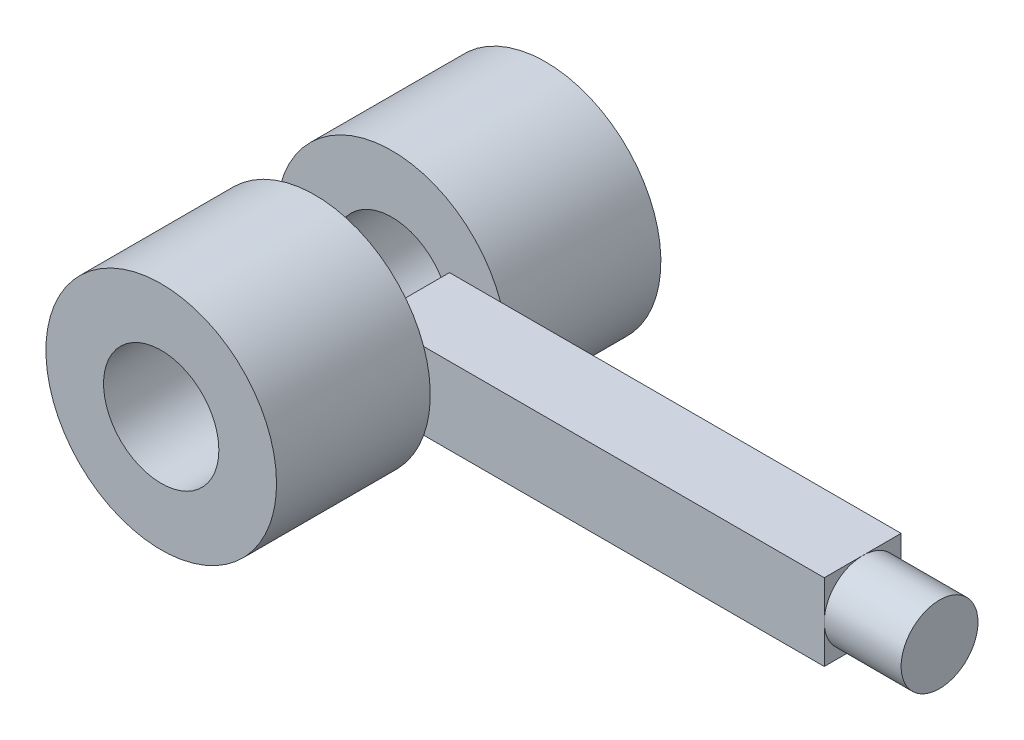
ISO-10303-21;
HEADER;
FILE_DESCRIPTION(('STEP AP214'),'2;1');
FILE_NAME('part.step','',(''),(''),'','','');
FILE_SCHEMA(('AUTOMOTIVE_DESIGN { 1 0 10303 214 1 1 1 1 }'));
ENDSEC;
DATA;
#1=APPLICATION_CONTEXT('core data for automotive mechanical design processes');
#2=APPLICATION_PROTOCOL_DEFINITION('international standard','automotive_design',2000,#1);
#3=PRODUCT_CONTEXT('',#1,'mechanical');
#4=PRODUCT('Part','Part','',(#3));
#5=PRODUCT_RELATED_PRODUCT_CATEGORY('part','',(#4));
#6=PRODUCT_DEFINITION_FORMATION('','',#4);
#7=PRODUCT_DEFINITION_CONTEXT('part definition',#1,'design');
#8=PRODUCT_DEFINITION('design','',#6,#7);
#9=PRODUCT_DEFINITION_SHAPE('','',#8);
#10=(LENGTH_UNIT() NAMED_UNIT(*) SI_UNIT(.MILLI.,.METRE.));
#11=(NAMED_UNIT(*) PLANE_ANGLE_UNIT() SI_UNIT($,.RADIAN.));
#12=(NAMED_UNIT(*) SI_UNIT($,.STERADIAN.) SOLID_ANGLE_UNIT());
#13=UNCERTAINTY_MEASURE_WITH_UNIT(LENGTH_MEASURE(1.E-05),#10,'distance_accuracy_value','');
#14=(GEOMETRIC_REPRESENTATION_CONTEXT(3) GLOBAL_UNCERTAINTY_ASSIGNED_CONTEXT((#13)) GLOBAL_UNIT_ASSIGNED_CONTEXT((#10,
#11,#12)) REPRESENTATION_CONTEXT('',''));
#15=CARTESIAN_POINT('',(0.,0.,0.));
#16=DIRECTION('',(0.,0.,1.));
#17=DIRECTION('',(1.,0.,0.));
#18=AXIS2_PLACEMENT_3D('',#15,#16,#17);
#19=CARTESIAN_POINT('',(13.25,0.,0.));
#20=DIRECTION('',(1.,0.,0.));
#21=DIRECTION('',(0.,0.,-1.));
#22=AXIS2_PLACEMENT_3D('',#19,#20,#21);
#23=PLANE('',#22);
#24=CARTESIAN_POINT('',(13.25,0.,-1.));
#25=DIRECTION('',(1.,0.,0.));
#26=DIRECTION('',(0.,0.,-1.));
#27=AXIS2_PLACEMENT_3D('',#24,#25,#26);
#28=CIRCLE('',#27,1.);
#29=CARTESIAN_POINT('',(13.25,0.,-2.));
#30=VERTEX_POINT('',#29);
#31=CARTESIAN_POINT('',(13.25,1.,-1.));
#32=VERTEX_POINT('',#31);
#33=EDGE_CURVE('E48',#30,#32,#28,.T.);
#34=ORIENTED_EDGE('',*,*,#33,.F.);
#35=DIRECTION('',(0.,1.,0.));
#36=VECTOR('',#35,1.);
#37=CARTESIAN_POINT('',(13.25,-1.,-2.));
#38=LINE('',#37,#36);
#39=CARTESIAN_POINT('',(13.25,1.,-2.));
#40=VERTEX_POINT('',#39);
#41=EDGE_CURVE('E117',#30,#40,#38,.T.);
#42=ORIENTED_EDGE('',*,*,#41,.T.);
#43=DIRECTION('',(0.,0.,1.));
#44=VECTOR('',#43,1.);
#45=CARTESIAN_POINT('',(13.25,1.,-2.));
#46=LINE('',#45,#44);
#47=EDGE_CURVE('E129',#40,#32,#46,.T.);
#48=ORIENTED_EDGE('',*,*,#47,.T.);
#49=EDGE_LOOP('',(#34,#42,#48));
#50=FACE_BOUND('',#49,.T.);
#51=ADVANCED_FACE('F37',(#50),#23,.T.);
#52=CARTESIAN_POINT('',(13.25,0.,0.));
#53=VERTEX_POINT('',#52);
#54=EDGE_CURVE('E11',#32,#53,#28,.T.);
#55=ORIENTED_EDGE('',*,*,#54,.F.);
#56=CARTESIAN_POINT('',(13.25,1.,0.));
#57=VERTEX_POINT('',#56);
#58=EDGE_CURVE('E142',#32,#57,#46,.T.);
#59=ORIENTED_EDGE('',*,*,#58,.T.);
#60=DIRECTION('',(0.,-1.,0.));
#61=VECTOR('',#60,1.);
#62=CARTESIAN_POINT('',(13.25,1.,0.));
#63=LINE('',#62,#61);
#64=EDGE_CURVE('E143',#57,#53,#63,.T.);
#65=ORIENTED_EDGE('',*,*,#64,.T.);
#66=EDGE_LOOP('',(#55,#59,#65));
#67=FACE_BOUND('',#66,.T.);
#68=ADVANCED_FACE('F218',(#67),#23,.T.);
#69=CARTESIAN_POINT('',(13.25,-1.,-1.));
#70=VERTEX_POINT('',#69);
#71=EDGE_CURVE('E46',#53,#70,#28,.T.);
#72=ORIENTED_EDGE('',*,*,#71,.F.);
#73=CARTESIAN_POINT('',(13.25,-1.,0.));
#74=VERTEX_POINT('',#73);
#75=EDGE_CURVE('E141',#53,#74,#63,.T.);
#76=ORIENTED_EDGE('',*,*,#75,.T.);
#77=DIRECTION('',(0.,0.,-1.));
#78=VECTOR('',#77,1.);
#79=CARTESIAN_POINT('',(13.25,-1.,0.));
#80=LINE('',#79,#78);
#81=EDGE_CURVE('E127',#74,#70,#80,.T.);
#82=ORIENTED_EDGE('',*,*,#81,.T.);
#83=EDGE_LOOP('',(#72,#76,#82));
#84=FACE_BOUND('',#83,.T.);
#85=ADVANCED_FACE('F216',(#84),#23,.T.);
#86=CARTESIAN_POINT('',(0.,0.,0.));
#87=DIRECTION('',(0.,0.,1.));
#88=DIRECTION('',(1.,0.,0.));
#89=AXIS2_PLACEMENT_3D('',#86,#87,#88);
#90=PLANE('',#89);
#91=CARTESIAN_POINT('',(0.,0.,0.));
#92=DIRECTION('',(0.,0.,1.));
#93=DIRECTION('',(1.,0.,0.));
#94=AXIS2_PLACEMENT_3D('',#91,#92,#93);
#95=CIRCLE('',#94,3.);
#96=CARTESIAN_POINT('',(2.82842712474619,1.,0.));
#97=VERTEX_POINT('',#96);
#98=CARTESIAN_POINT('',(2.82842712474619,-1.,0.));
#99=VERTEX_POINT('',#98);
#100=EDGE_CURVE('E41',#97,#99,#95,.T.);
#101=ORIENTED_EDGE('',*,*,#100,.F.);
#102=DIRECTION('',(-1.,0.,0.));
#103=VECTOR('',#102,1.);
#104=CARTESIAN_POINT('',(2.5,1.,0.));
#105=LINE('',#104,#103);
#106=CARTESIAN_POINT('',(1.5,1.,0.));
#107=VERTEX_POINT('',#106);
#108=EDGE_CURVE('E187',#97,#107,#105,.T.);
#109=ORIENTED_EDGE('',*,*,#108,.T.);
#110=DIRECTION('',(0.,-1.,0.));
#111=VECTOR('',#110,1.);
#112=CARTESIAN_POINT('',(1.5,-1.,0.));
#113=LINE('',#112,#111);
#114=CARTESIAN_POINT('',(1.5,0.,0.));
#115=VERTEX_POINT('',#114);
#116=EDGE_CURVE('E137',#107,#115,#113,.T.);
#117=ORIENTED_EDGE('',*,*,#116,.T.);
#118=CARTESIAN_POINT('',(0.,0.,0.));
#119=DIRECTION('',(0.,0.,1.));
#120=DIRECTION('',(1.,0.,0.));
#121=AXIS2_PLACEMENT_3D('',#118,#119,#120);
#122=CIRCLE('',#121,1.5);
#123=EDGE_CURVE('E190',#115,#115,#122,.T.);
#124=ORIENTED_EDGE('',*,*,#123,.T.);
#125=CARTESIAN_POINT('',(1.5,-1.,0.));
#126=VERTEX_POINT('',#125);
#127=EDGE_CURVE('E133',#115,#126,#113,.T.);
#128=ORIENTED_EDGE('',*,*,#127,.T.);
#129=DIRECTION('',(1.,0.,0.));
#130=VECTOR('',#129,1.);
#131=CARTESIAN_POINT('',(2.5,-1.,0.));
#132=LINE('',#131,#130);
#133=EDGE_CURVE('E191',#126,#99,#132,.T.);
#134=ORIENTED_EDGE('',*,*,#133,.T.);
#135=EDGE_LOOP('',(#101,#109,#117,#124,#128,#134));
#136=FACE_BOUND('',#135,.T.);
#137=ADVANCED_FACE('F206',(#136),#90,.F.);
#138=CARTESIAN_POINT('',(0.,0.,-2.));
#139=DIRECTION('',(0.,0.,-1.));
#140=DIRECTION('',(-1.,0.,0.));
#141=AXIS2_PLACEMENT_3D('',#138,#139,#140);
#142=PLANE('',#141);
#143=DIRECTION('',(-1.,0.,0.));
#144=VECTOR('',#143,1.);
#145=CARTESIAN_POINT('',(2.5,1.,-2.));
#146=LINE('',#145,#144);
#147=CARTESIAN_POINT('',(2.82842712474619,1.,-2.));
#148=VERTEX_POINT('',#147);
#149=CARTESIAN_POINT('',(1.5,1.,-2.));
#150=VERTEX_POINT('',#149);
#151=EDGE_CURVE('E173',#148,#150,#146,.T.);
#152=ORIENTED_EDGE('',*,*,#151,.F.);
#153=CARTESIAN_POINT('',(0.,0.,-2.));
#154=DIRECTION('',(0.,0.,-1.));
#155=DIRECTION('',(-1.,0.,0.));
#156=AXIS2_PLACEMENT_3D('',#153,#154,#155);
#157=CIRCLE('',#156,3.);
#158=CARTESIAN_POINT('',(2.82842712474619,-1.,-2.));
#159=VERTEX_POINT('',#158);
#160=EDGE_CURVE('E163',#159,#148,#157,.T.);
#161=ORIENTED_EDGE('',*,*,#160,.F.);
#162=DIRECTION('',(1.,0.,0.));
#163=VECTOR('',#162,1.);
#164=CARTESIAN_POINT('',(2.5,-1.,-2.));
#165=LINE('',#164,#163);
#166=CARTESIAN_POINT('',(1.5,-1.,-2.));
#167=VERTEX_POINT('',#166);
#168=EDGE_CURVE('E176',#167,#159,#165,.T.);
#169=ORIENTED_EDGE('',*,*,#168,.F.);
#170=DIRECTION('',(0.,-1.,0.));
#171=VECTOR('',#170,1.);
#172=CARTESIAN_POINT('',(1.5,-1.,-2.));
#173=LINE('',#172,#171);
#174=CARTESIAN_POINT('',(1.5,0.,-2.));
#175=VERTEX_POINT('',#174);
#176=EDGE_CURVE('E169',#175,#167,#173,.T.);
#177=ORIENTED_EDGE('',*,*,#176,.F.);
#178=CARTESIAN_POINT('',(0.,0.,-2.));
#179=DIRECTION('',(0.,0.,-1.));
#180=DIRECTION('',(-1.,0.,0.));
#181=AXIS2_PLACEMENT_3D('',#178,#179,#180);
#182=CIRCLE('',#181,1.5);
#183=EDGE_CURVE('E159',#175,#175,#182,.T.);
#184=ORIENTED_EDGE('',*,*,#183,.T.);
#185=EDGE_CURVE('E177',#150,#175,#173,.T.);
#186=ORIENTED_EDGE('',*,*,#185,.F.);
#187=EDGE_LOOP('',(#152,#161,#169,#177,#184,#186));
#188=FACE_BOUND('',#187,.T.);
#189=ADVANCED_FACE('F253',(#188),#142,.F.);
#190=CARTESIAN_POINT('',(0.,0.,4.));
#191=DIRECTION('',(0.,0.,1.));
#192=DIRECTION('',(1.,0.,0.));
#193=AXIS2_PLACEMENT_3D('',#190,#191,#192);
#194=PLANE('',#193);
#195=CARTESIAN_POINT('',(0.,0.,4.));
#196=DIRECTION('',(0.,0.,1.));
#197=DIRECTION('',(1.,0.,0.));
#198=AXIS2_PLACEMENT_3D('',#195,#196,#197);
#199=CIRCLE('',#198,3.);
#200=CARTESIAN_POINT('',(3.,0.,4.));
#201=VERTEX_POINT('',#200);
#202=EDGE_CURVE('E135',#201,#201,#199,.T.);
#203=ORIENTED_EDGE('',*,*,#202,.T.);
#204=EDGE_LOOP('',(#203));
#205=FACE_BOUND('',#204,.T.);
#206=CARTESIAN_POINT('',(0.,0.,4.));
#207=DIRECTION('',(0.,0.,1.));
#208=DIRECTION('',(1.,0.,0.));
#209=AXIS2_PLACEMENT_3D('',#206,#207,#208);
#210=CIRCLE('',#209,1.5);
#211=CARTESIAN_POINT('',(1.5,0.,4.));
#212=VERTEX_POINT('',#211);
#213=EDGE_CURVE('E194',#212,#212,#210,.T.);
#214=ORIENTED_EDGE('',*,*,#213,.F.);
#215=EDGE_LOOP('',(#214));
#216=FACE_BOUND('',#215,.T.);
#217=ADVANCED_FACE('F256',(#205,#216),#194,.T.);
#218=CARTESIAN_POINT('',(0.,0.,4.));
#219=DIRECTION('',(0.,0.,-1.));
#220=DIRECTION('',(-1.,0.,0.));
#221=AXIS2_PLACEMENT_3D('',#218,#219,#220);
#222=CYLINDRICAL_SURFACE('',#221,3.);
#223=ORIENTED_EDGE('',*,*,#202,.F.);
#224=EDGE_LOOP('',(#223));
#225=FACE_BOUND('',#224,.T.);
#226=ORIENTED_EDGE('',*,*,#100,.T.);
#227=CARTESIAN_POINT('',(0.,0.,0.));
#228=DIRECTION('',(0.,0.,-1.));
#229=DIRECTION('',(-1.,0.,0.));
#230=AXIS2_PLACEMENT_3D('',#227,#228,#229);
#231=CIRCLE('',#230,3.);
#232=EDGE_CURVE('E156',#97,#99,#231,.T.);
#233=ORIENTED_EDGE('',*,*,#232,.F.);
#234=EDGE_LOOP('',(#226,#233));
#235=FACE_BOUND('',#234,.T.);
#236=ADVANCED_FACE('F39',(#225,#235),#222,.T.);
#237=CARTESIAN_POINT('',(0.,0.,4.));
#238=DIRECTION('',(0.,0.,-1.));
#239=DIRECTION('',(-1.,0.,0.));
#240=AXIS2_PLACEMENT_3D('',#237,#238,#239);
#241=CYLINDRICAL_SURFACE('',#240,1.5);
#242=ORIENTED_EDGE('',*,*,#213,.T.);
#243=EDGE_LOOP('',(#242));
#244=FACE_BOUND('',#243,.T.);
#245=ORIENTED_EDGE('',*,*,#123,.F.);
#246=EDGE_LOOP('',(#245));
#247=FACE_BOUND('',#246,.T.);
#248=ADVANCED_FACE('F264',(#244,#247),#241,.F.);
#249=CARTESIAN_POINT('',(2.5,-1.,4.002));
#250=DIRECTION('',(0.,1.,0.));
#251=DIRECTION('',(-1.,0.,0.));
#252=AXIS2_PLACEMENT_3D('',#249,#250,#251);
#253=PLANE('',#252);
#254=ORIENTED_EDGE('',*,*,#133,.F.);
#255=DIRECTION('',(0.,0.,-1.));
#256=VECTOR('',#255,1.);
#257=CARTESIAN_POINT('',(1.5,-1.,4.002));
#258=LINE('',#257,#256);
#259=EDGE_CURVE('E182',#126,#167,#258,.T.);
#260=ORIENTED_EDGE('',*,*,#259,.T.);
#261=ORIENTED_EDGE('',*,*,#168,.T.);
#262=DIRECTION('',(-1.,0.,0.));
#263=VECTOR('',#262,1.);
#264=CARTESIAN_POINT('',(13.25,-1.,-2.));
#265=LINE('',#264,#263);
#266=CARTESIAN_POINT('',(13.25,-1.,-2.));
#267=VERTEX_POINT('',#266);
#268=EDGE_CURVE('E148',#267,#159,#265,.T.);
#269=ORIENTED_EDGE('',*,*,#268,.F.);
#270=EDGE_CURVE('E112',#70,#267,#80,.T.);
#271=ORIENTED_EDGE('',*,*,#270,.F.);
#272=ORIENTED_EDGE('',*,*,#81,.F.);
#273=DIRECTION('',(-1.,0.,0.));
#274=VECTOR('',#273,1.);
#275=CARTESIAN_POINT('',(13.25,-1.,0.));
#276=LINE('',#275,#274);
#277=EDGE_CURVE('E150',#74,#99,#276,.T.);
#278=ORIENTED_EDGE('',*,*,#277,.T.);
#279=EDGE_LOOP('',(#254,#260,#261,#269,#271,#272,#278));
#280=FACE_BOUND('',#279,.T.);
#281=ADVANCED_FACE('F215',(#280),#253,.F.);
#282=CARTESIAN_POINT('',(1.5,-1.,4.002));
#283=DIRECTION('',(1.,0.,0.));
#284=DIRECTION('',(0.,1.,0.));
#285=AXIS2_PLACEMENT_3D('',#282,#283,#284);
#286=PLANE('',#285);
#287=ORIENTED_EDGE('',*,*,#116,.F.);
#288=DIRECTION('',(0.,0.,-1.));
#289=VECTOR('',#288,1.);
#290=CARTESIAN_POINT('',(1.5,1.,4.002));
#291=LINE('',#290,#289);
#292=EDGE_CURVE('E179',#107,#150,#291,.T.);
#293=ORIENTED_EDGE('',*,*,#292,.T.);
#294=ORIENTED_EDGE('',*,*,#185,.T.);
#295=ORIENTED_EDGE('',*,*,#176,.T.);
#296=ORIENTED_EDGE('',*,*,#259,.F.);
#297=ORIENTED_EDGE('',*,*,#127,.F.);
#298=EDGE_LOOP('',(#287,#293,#294,#295,#296,#297));
#299=FACE_BOUND('',#298,.T.);
#300=ADVANCED_FACE('F263',(#299),#286,.F.);
#301=CARTESIAN_POINT('',(2.5,1.,4.002));
#302=DIRECTION('',(0.,-1.,0.));
#303=DIRECTION('',(0.,0.,-1.));
#304=AXIS2_PLACEMENT_3D('',#301,#302,#303);
#305=PLANE('',#304);
#306=ORIENTED_EDGE('',*,*,#108,.F.);
#307=DIRECTION('',(-1.,0.,0.));
#308=VECTOR('',#307,1.);
#309=CARTESIAN_POINT('',(13.25,1.,0.));
#310=LINE('',#309,#308);
#311=EDGE_CURVE('E153',#57,#97,#310,.T.);
#312=ORIENTED_EDGE('',*,*,#311,.F.);
#313=ORIENTED_EDGE('',*,*,#58,.F.);
#314=ORIENTED_EDGE('',*,*,#47,.F.);
#315=DIRECTION('',(-1.,0.,0.));
#316=VECTOR('',#315,1.);
#317=CARTESIAN_POINT('',(13.25,1.,-2.));
#318=LINE('',#317,#316);
#319=EDGE_CURVE('E116',#40,#148,#318,.T.);
#320=ORIENTED_EDGE('',*,*,#319,.T.);
#321=ORIENTED_EDGE('',*,*,#151,.T.);
#322=ORIENTED_EDGE('',*,*,#292,.F.);
#323=EDGE_LOOP('',(#306,#312,#313,#314,#320,#321,#322));
#324=FACE_BOUND('',#323,.T.);
#325=ADVANCED_FACE('F251',(#324),#305,.F.);
#326=CARTESIAN_POINT('',(0.,0.,-6.));
#327=DIRECTION('',(0.,0.,-1.));
#328=DIRECTION('',(-1.,0.,0.));
#329=AXIS2_PLACEMENT_3D('',#326,#327,#328);
#330=PLANE('',#329);
#331=CARTESIAN_POINT('',(0.,0.,-6.));
#332=DIRECTION('',(0.,0.,-1.));
#333=DIRECTION('',(-1.,0.,0.));
#334=AXIS2_PLACEMENT_3D('',#331,#332,#333);
#335=CIRCLE('',#334,3.);
#336=CARTESIAN_POINT('',(-3.,0.,-6.));
#337=VERTEX_POINT('',#336);
#338=EDGE_CURVE('E166',#337,#337,#335,.T.);
#339=ORIENTED_EDGE('',*,*,#338,.T.);
#340=EDGE_LOOP('',(#339));
#341=FACE_BOUND('',#340,.T.);
#342=CARTESIAN_POINT('',(0.,0.,-6.));
#343=DIRECTION('',(0.,0.,-1.));
#344=DIRECTION('',(-1.,0.,0.));
#345=AXIS2_PLACEMENT_3D('',#342,#343,#344);
#346=CIRCLE('',#345,1.5);
#347=CARTESIAN_POINT('',(-1.5,0.,-6.));
#348=VERTEX_POINT('',#347);
#349=EDGE_CURVE('E160',#348,#348,#346,.T.);
#350=ORIENTED_EDGE('',*,*,#349,.F.);
#351=EDGE_LOOP('',(#350));
#352=FACE_BOUND('',#351,.T.);
#353=ADVANCED_FACE('F248',(#341,#352),#330,.T.);
#354=CARTESIAN_POINT('',(0.,0.,-6.));
#355=DIRECTION('',(0.,0.,1.));
#356=DIRECTION('',(1.,0.,0.));
#357=AXIS2_PLACEMENT_3D('',#354,#355,#356);
#358=CYLINDRICAL_SURFACE('',#357,3.);
#359=ORIENTED_EDGE('',*,*,#338,.F.);
#360=EDGE_LOOP('',(#359));
#361=FACE_BOUND('',#360,.T.);
#362=EDGE_CURVE('E170',#148,#159,#157,.T.);
#363=ORIENTED_EDGE('',*,*,#362,.T.);
#364=ORIENTED_EDGE('',*,*,#160,.T.);
#365=EDGE_LOOP('',(#363,#364));
#366=FACE_BOUND('',#365,.T.);
#367=ADVANCED_FACE('F246',(#361,#366),#358,.T.);
#368=CARTESIAN_POINT('',(0.,0.,-6.));
#369=DIRECTION('',(0.,0.,1.));
#370=DIRECTION('',(1.,0.,0.));
#371=AXIS2_PLACEMENT_3D('',#368,#369,#370);
#372=CYLINDRICAL_SURFACE('',#371,1.5);
#373=ORIENTED_EDGE('',*,*,#349,.T.);
#374=EDGE_LOOP('',(#373));
#375=FACE_BOUND('',#374,.T.);
#376=ORIENTED_EDGE('',*,*,#183,.F.);
#377=EDGE_LOOP('',(#376));
#378=FACE_BOUND('',#377,.T.);
#379=ADVANCED_FACE('F243',(#375,#378),#372,.F.);
#380=CARTESIAN_POINT('',(13.25,1.,0.));
#381=DIRECTION('',(0.,0.,-1.));
#382=DIRECTION('',(-1.,0.,0.));
#383=AXIS2_PLACEMENT_3D('',#380,#381,#382);
#384=PLANE('',#383);
#385=ORIENTED_EDGE('',*,*,#311,.T.);
#386=ORIENTED_EDGE('',*,*,#232,.T.);
#387=ORIENTED_EDGE('',*,*,#277,.F.);
#388=ORIENTED_EDGE('',*,*,#75,.F.);
#389=ORIENTED_EDGE('',*,*,#64,.F.);
#390=EDGE_LOOP('',(#385,#386,#387,#388,#389));
#391=FACE_BOUND('',#390,.T.);
#392=ADVANCED_FACE('F211',(#391),#384,.F.);
#393=CARTESIAN_POINT('',(13.25,-1.,-2.));
#394=DIRECTION('',(0.,0.,1.));
#395=DIRECTION('',(1.,0.,0.));
#396=AXIS2_PLACEMENT_3D('',#393,#394,#395);
#397=PLANE('',#396);
#398=ORIENTED_EDGE('',*,*,#268,.T.);
#399=ORIENTED_EDGE('',*,*,#362,.F.);
#400=ORIENTED_EDGE('',*,*,#319,.F.);
#401=ORIENTED_EDGE('',*,*,#41,.F.);
#402=EDGE_CURVE('E109',#267,#30,#38,.T.);
#403=ORIENTED_EDGE('',*,*,#402,.F.);
#404=EDGE_LOOP('',(#398,#399,#400,#401,#403));
#405=FACE_BOUND('',#404,.T.);
#406=ADVANCED_FACE('F121',(#405),#397,.F.);
#407=EDGE_CURVE('E55',#70,#30,#28,.T.);
#408=ORIENTED_EDGE('',*,*,#407,.F.);
#409=ORIENTED_EDGE('',*,*,#270,.T.);
#410=ORIENTED_EDGE('',*,*,#402,.T.);
#411=EDGE_LOOP('',(#408,#409,#410));
#412=FACE_BOUND('',#411,.T.);
#413=ADVANCED_FACE('F111',(#412),#23,.T.);
#414=CARTESIAN_POINT('',(15.25,0.,-1.));
#415=DIRECTION('',(-1.,0.,0.));
#416=DIRECTION('',(0.,0.,1.));
#417=AXIS2_PLACEMENT_3D('',#414,#415,#416);
#418=CYLINDRICAL_SURFACE('',#417,1.);
#419=CARTESIAN_POINT('',(15.25,0.,-1.));
#420=DIRECTION('',(1.,0.,0.));
#421=DIRECTION('',(0.,0.,-1.));
#422=AXIS2_PLACEMENT_3D('',#419,#420,#421);
#423=CIRCLE('',#422,1.);
#424=CARTESIAN_POINT('',(15.25,0.,-2.));
#425=VERTEX_POINT('',#424);
#426=EDGE_CURVE('E131',#425,#425,#423,.T.);
#427=ORIENTED_EDGE('',*,*,#426,.F.);
#428=EDGE_LOOP('',(#427));
#429=FACE_BOUND('',#428,.T.);
#430=ORIENTED_EDGE('',*,*,#33,.T.);
#431=ORIENTED_EDGE('',*,*,#54,.T.);
#432=ORIENTED_EDGE('',*,*,#71,.T.);
#433=ORIENTED_EDGE('',*,*,#407,.T.);
#434=EDGE_LOOP('',(#430,#431,#432,#433));
#435=FACE_BOUND('',#434,.T.);
#436=ADVANCED_FACE('F132',(#429,#435),#418,.T.);
#437=CARTESIAN_POINT('',(15.25,0.,-1.));
#438=DIRECTION('',(1.,0.,0.));
#439=DIRECTION('',(0.,0.,-1.));
#440=AXIS2_PLACEMENT_3D('',#437,#438,#439);
#441=PLANE('',#440);
#442=ORIENTED_EDGE('',*,*,#426,.T.);
#443=EDGE_LOOP('',(#442));
#444=FACE_BOUND('',#443,.T.);
#445=ADVANCED_FACE('F224',(#444),#441,.T.);
#446=CLOSED_SHELL('',(#51,#68,#85,#137,#189,#217,#236,#248,#281,#300,#325,#353,#367,#379,#392,
#406,#413,#436,#445));
#447=MANIFOLD_SOLID_BREP('B2',#446);
#448=ADVANCED_BREP_SHAPE_REPRESENTATION('',(#18,#447),#14);
#449=SHAPE_DEFINITION_REPRESENTATION(#9,#448);
ENDSEC;
END-ISO-10303-21;
